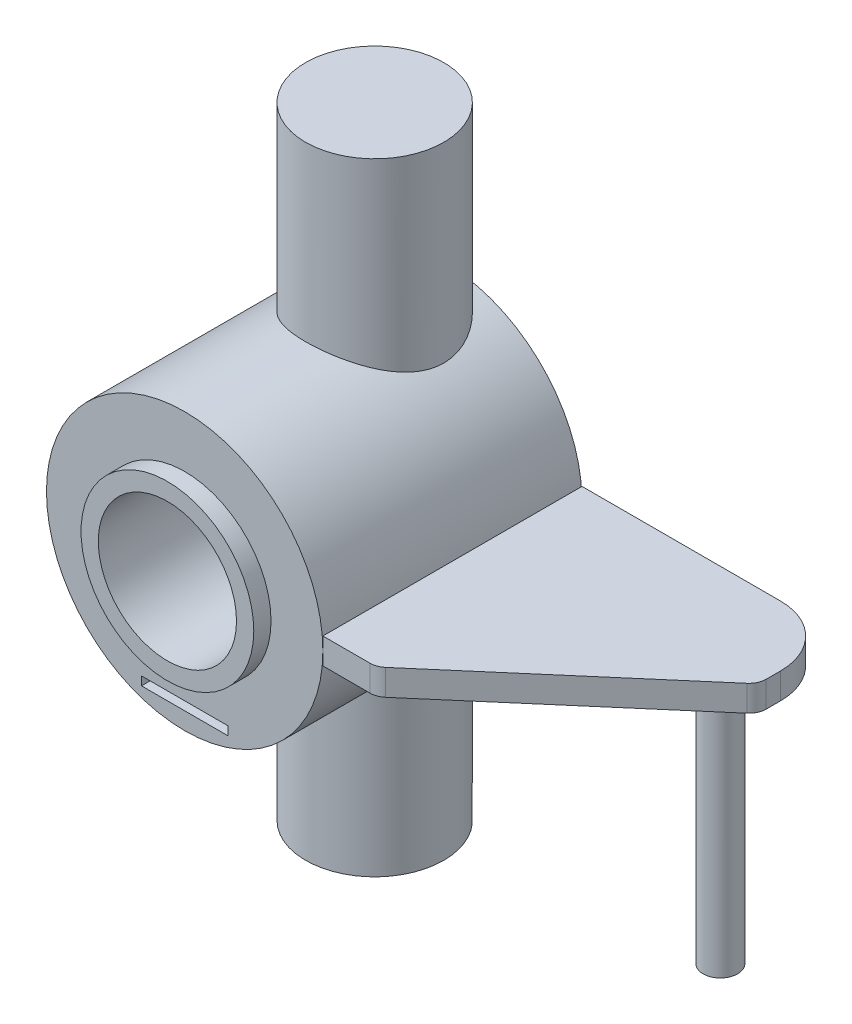
ISO-10303-21;
HEADER;
FILE_DESCRIPTION(('STEP AP214'),'2;1');
FILE_NAME('part.step','',(''),(''),'','','');
FILE_SCHEMA(('AUTOMOTIVE_DESIGN { 1 0 10303 214 1 1 1 1 }'));
ENDSEC;
DATA;
#1=APPLICATION_CONTEXT('core data for automotive mechanical design processes');
#2=APPLICATION_PROTOCOL_DEFINITION('international standard','automotive_design',2000,#1);
#3=PRODUCT_CONTEXT('',#1,'mechanical');
#4=PRODUCT('Part','Part','',(#3));
#5=PRODUCT_RELATED_PRODUCT_CATEGORY('part','',(#4));
#6=PRODUCT_DEFINITION_FORMATION('','',#4);
#7=PRODUCT_DEFINITION_CONTEXT('part definition',#1,'design');
#8=PRODUCT_DEFINITION('design','',#6,#7);
#9=PRODUCT_DEFINITION_SHAPE('','',#8);
#10=(LENGTH_UNIT() NAMED_UNIT(*) SI_UNIT(.MILLI.,.METRE.));
#11=(NAMED_UNIT(*) PLANE_ANGLE_UNIT() SI_UNIT($,.RADIAN.));
#12=(NAMED_UNIT(*) SI_UNIT($,.STERADIAN.) SOLID_ANGLE_UNIT());
#13=UNCERTAINTY_MEASURE_WITH_UNIT(LENGTH_MEASURE(1.E-05),#10,'distance_accuracy_value','');
#14=(GEOMETRIC_REPRESENTATION_CONTEXT(3) GLOBAL_UNCERTAINTY_ASSIGNED_CONTEXT((#13)) GLOBAL_UNIT_ASSIGNED_CONTEXT((#10,
#11,#12)) REPRESENTATION_CONTEXT('',''));
#15=CARTESIAN_POINT('',(0.,0.,0.));
#16=DIRECTION('',(0.,0.,1.));
#17=DIRECTION('',(1.,0.,0.));
#18=AXIS2_PLACEMENT_3D('',#15,#16,#17);
#19=CARTESIAN_POINT('',(23.,0.750000000000004,0.));
#20=DIRECTION('',(0.,-1.,0.));
#21=DIRECTION('',(0.,0.,-1.));
#22=AXIS2_PLACEMENT_3D('',#19,#20,#21);
#23=PLANE('',#22);
#24=DIRECTION('',(0.758813097039513,0.,-0.651308439805062));
#25=VECTOR('',#24,1.);
#26=CARTESIAN_POINT('',(25.3687248158512,0.750000000000003,2.75970539256084));
#27=LINE('',#26,#25);
#28=CARTESIAN_POINT('',(11.3890501755666,0.749999999999998,14.7588130970395));
#29=VERTEX_POINT('',#28);
#30=CARTESIAN_POINT('',(22.6513084398051,0.750000000000002,5.09213247781869));
#31=VERTEX_POINT('',#30);
#32=EDGE_CURVE('E126',#29,#31,#27,.T.);
#33=ORIENTED_EDGE('',*,*,#32,.T.);
#34=CARTESIAN_POINT('',(22.,0.750000000000002,4.33331938077917));
#35=DIRECTION('',(0.,-1.,0.));
#36=DIRECTION('',(0.,0.,-1.));
#37=AXIS2_PLACEMENT_3D('',#34,#35,#36);
#38=CIRCLE('',#37,1.);
#39=CARTESIAN_POINT('',(23.,0.750000000000002,4.33331938077917));
#40=VERTEX_POINT('',#39);
#41=EDGE_CURVE('E74',#31,#40,#38,.F.);
#42=ORIENTED_EDGE('',*,*,#41,.T.);
#43=DIRECTION('',(0.,0.,1.));
#44=VECTOR('',#43,1.);
#45=CARTESIAN_POINT('',(23.,0.750000000000004,0.));
#46=LINE('',#45,#44);
#47=CARTESIAN_POINT('',(23.,0.750000000000002,3.5));
#48=VERTEX_POINT('',#47);
#49=EDGE_CURVE('E146',#48,#40,#46,.T.);
#50=ORIENTED_EDGE('',*,*,#49,.F.);
#51=CARTESIAN_POINT('',(19.5,0.750000000000002,3.5));
#52=DIRECTION('',(0.,-1.,0.));
#53=DIRECTION('',(0.,0.,-1.));
#54=AXIS2_PLACEMENT_3D('',#51,#52,#53);
#55=CIRCLE('',#54,3.5);
#56=CARTESIAN_POINT('',(19.5,0.750000000000004,0.));
#57=VERTEX_POINT('',#56);
#58=EDGE_CURVE('E135',#57,#48,#55,.T.);
#59=ORIENTED_EDGE('',*,*,#58,.F.);
#60=DIRECTION('',(-1.,0.,0.));
#61=VECTOR('',#60,1.);
#62=CARTESIAN_POINT('',(23.,0.750000000000004,0.));
#63=LINE('',#62,#61);
#64=CARTESIAN_POINT('',(8.,0.750000000000004,0.));
#65=VERTEX_POINT('',#64);
#66=EDGE_CURVE('E134',#57,#65,#63,.T.);
#67=ORIENTED_EDGE('',*,*,#66,.T.);
#68=DIRECTION('',(0.,0.,1.));
#69=VECTOR('',#68,1.);
#70=CARTESIAN_POINT('',(8.,0.750000000000004,0.));
#71=LINE('',#70,#69);
#72=CARTESIAN_POINT('',(8.,0.749999999999998,15.));
#73=VERTEX_POINT('',#72);
#74=EDGE_CURVE('E226',#65,#73,#71,.T.);
#75=ORIENTED_EDGE('',*,*,#74,.T.);
#76=DIRECTION('',(-1.,0.,0.));
#77=VECTOR('',#76,1.);
#78=CARTESIAN_POINT('',(23.,0.749999999999998,15.));
#79=LINE('',#78,#77);
#80=CARTESIAN_POINT('',(10.7377417357616,0.749999999999998,15.));
#81=VERTEX_POINT('',#80);
#82=EDGE_CURVE('E144',#81,#73,#79,.T.);
#83=ORIENTED_EDGE('',*,*,#82,.F.);
#84=CARTESIAN_POINT('',(10.7377417357616,0.749999999999999,14.));
#85=DIRECTION('',(0.,-1.,0.));
#86=DIRECTION('',(0.,0.,-1.));
#87=AXIS2_PLACEMENT_3D('',#84,#85,#86);
#88=CIRCLE('',#87,1.);
#89=EDGE_CURVE('E161',#81,#29,#88,.F.);
#90=ORIENTED_EDGE('',*,*,#89,.T.);
#91=EDGE_LOOP('',(#33,#42,#50,#59,#67,#75,#83,#90));
#92=FACE_BOUND('',#91,.T.);
#93=ADVANCED_FACE('F51',(#92),#23,.F.);
#94=CARTESIAN_POINT('',(23.,-0.750000000000004,0.));
#95=DIRECTION('',(0.,1.,0.));
#96=DIRECTION('',(0.,0.,1.));
#97=AXIS2_PLACEMENT_3D('',#94,#95,#96);
#98=PLANE('',#97);
#99=CARTESIAN_POINT('',(19.4463189334762,-0.750000000000004,3.43499495567666));
#100=DIRECTION('',(0.,1.,0.));
#101=DIRECTION('',(0.,0.,1.));
#102=AXIS2_PLACEMENT_3D('',#99,#100,#101);
#103=CIRCLE('',#102,1.);
#104=CARTESIAN_POINT('',(19.4463189334762,-0.750000000000004,4.43499495567666));
#105=VERTEX_POINT('',#104);
#106=EDGE_CURVE('E12',#105,#105,#103,.F.);
#107=ORIENTED_EDGE('',*,*,#106,.F.);
#108=EDGE_LOOP('',(#107));
#109=FACE_BOUND('',#108,.T.);
#110=DIRECTION('',(0.,0.,-1.));
#111=VECTOR('',#110,1.);
#112=CARTESIAN_POINT('',(23.,-0.750000000000004,0.));
#113=LINE('',#112,#111);
#114=CARTESIAN_POINT('',(23.,-0.750000000000003,4.33331938077917));
#115=VERTEX_POINT('',#114);
#116=CARTESIAN_POINT('',(23.,-0.750000000000003,3.5));
#117=VERTEX_POINT('',#116);
#118=EDGE_CURVE('E142',#115,#117,#113,.T.);
#119=ORIENTED_EDGE('',*,*,#118,.F.);
#120=CARTESIAN_POINT('',(22.,-0.750000000000004,4.33331938077917));
#121=DIRECTION('',(0.,1.,0.));
#122=DIRECTION('',(0.,0.,1.));
#123=AXIS2_PLACEMENT_3D('',#120,#121,#122);
#124=CIRCLE('',#123,1.);
#125=CARTESIAN_POINT('',(22.6513084398051,-0.750000000000003,5.09213247781868));
#126=VERTEX_POINT('',#125);
#127=EDGE_CURVE('E59',#115,#126,#124,.F.);
#128=ORIENTED_EDGE('',*,*,#127,.T.);
#129=DIRECTION('',(0.758813097039512,0.,-0.651308439805062));
#130=VECTOR('',#129,1.);
#131=CARTESIAN_POINT('',(12.1253865423612,-0.750000000000002,14.1267970022992));
#132=LINE('',#131,#130);
#133=CARTESIAN_POINT('',(11.3890501755666,-0.750000000000002,14.7588130970395));
#134=VERTEX_POINT('',#133);
#135=EDGE_CURVE('E170',#134,#126,#132,.T.);
#136=ORIENTED_EDGE('',*,*,#135,.F.);
#137=CARTESIAN_POINT('',(10.7377417357616,-0.750000000000002,14.));
#138=DIRECTION('',(0.,1.,0.));
#139=DIRECTION('',(0.,0.,1.));
#140=AXIS2_PLACEMENT_3D('',#137,#138,#139);
#141=CIRCLE('',#140,1.);
#142=CARTESIAN_POINT('',(10.7377417357616,-0.750000000000002,15.));
#143=VERTEX_POINT('',#142);
#144=EDGE_CURVE('E157',#134,#143,#141,.F.);
#145=ORIENTED_EDGE('',*,*,#144,.T.);
#146=DIRECTION('',(-1.,0.,0.));
#147=VECTOR('',#146,1.);
#148=CARTESIAN_POINT('',(23.,-0.750000000000002,15.));
#149=LINE('',#148,#147);
#150=CARTESIAN_POINT('',(8.,-0.750000000000002,15.));
#151=VERTEX_POINT('',#150);
#152=EDGE_CURVE('E141',#143,#151,#149,.T.);
#153=ORIENTED_EDGE('',*,*,#152,.T.);
#154=DIRECTION('',(0.,0.,-1.));
#155=VECTOR('',#154,1.);
#156=CARTESIAN_POINT('',(8.,-0.750000000000004,0.));
#157=LINE('',#156,#155);
#158=CARTESIAN_POINT('',(8.,-0.750000000000004,0.));
#159=VERTEX_POINT('',#158);
#160=EDGE_CURVE('E139',#151,#159,#157,.T.);
#161=ORIENTED_EDGE('',*,*,#160,.T.);
#162=DIRECTION('',(-1.,0.,0.));
#163=VECTOR('',#162,1.);
#164=CARTESIAN_POINT('',(23.,-0.750000000000004,0.));
#165=LINE('',#164,#163);
#166=CARTESIAN_POINT('',(19.5,-0.750000000000004,0.));
#167=VERTEX_POINT('',#166);
#168=EDGE_CURVE('E132',#167,#159,#165,.T.);
#169=ORIENTED_EDGE('',*,*,#168,.F.);
#170=CARTESIAN_POINT('',(19.5,-0.750000000000003,3.5));
#171=DIRECTION('',(0.,-1.,0.));
#172=DIRECTION('',(0.,0.,-1.));
#173=AXIS2_PLACEMENT_3D('',#170,#171,#172);
#174=CIRCLE('',#173,3.5);
#175=EDGE_CURVE('E117',#167,#117,#174,.T.);
#176=ORIENTED_EDGE('',*,*,#175,.T.);
#177=EDGE_LOOP('',(#119,#128,#136,#145,#153,#161,#169,#176));
#178=FACE_BOUND('',#177,.T.);
#179=ADVANCED_FACE('F137',(#109,#178),#98,.F.);
#180=CARTESIAN_POINT('',(23.,-0.750000000000004,0.));
#181=DIRECTION('',(0.,0.,1.));
#182=DIRECTION('',(0.,-1.,0.));
#183=AXIS2_PLACEMENT_3D('',#180,#181,#182);
#184=PLANE('',#183);
#185=ORIENTED_EDGE('',*,*,#66,.F.);
#186=DIRECTION('',(0.,-1.,0.));
#187=VECTOR('',#186,1.);
#188=CARTESIAN_POINT('',(19.5,14.25,0.));
#189=LINE('',#188,#187);
#190=EDGE_CURVE('E120',#57,#167,#189,.T.);
#191=ORIENTED_EDGE('',*,*,#190,.T.);
#192=ORIENTED_EDGE('',*,*,#168,.T.);
#193=DIRECTION('',(0.,1.,0.));
#194=VECTOR('',#193,1.);
#195=CARTESIAN_POINT('',(8.,-0.750000000000004,0.));
#196=LINE('',#195,#194);
#197=EDGE_CURVE('E223',#159,#65,#196,.T.);
#198=ORIENTED_EDGE('',*,*,#197,.T.);
#199=EDGE_LOOP('',(#185,#191,#192,#198));
#200=FACE_BOUND('',#199,.T.);
#201=ADVANCED_FACE('F130',(#200),#184,.F.);
#202=CARTESIAN_POINT('',(23.,-0.750000000000002,15.));
#203=DIRECTION('',(0.,0.,-1.));
#204=DIRECTION('',(-1.,0.,0.));
#205=AXIS2_PLACEMENT_3D('',#202,#203,#204);
#206=PLANE('',#205);
#207=ORIENTED_EDGE('',*,*,#152,.F.);
#208=DIRECTION('',(0.,-1.,0.));
#209=VECTOR('',#208,1.);
#210=CARTESIAN_POINT('',(10.7377417357616,-0.750000000000004,15.));
#211=LINE('',#210,#209);
#212=EDGE_CURVE('E159',#143,#81,#211,.F.);
#213=ORIENTED_EDGE('',*,*,#212,.T.);
#214=ORIENTED_EDGE('',*,*,#82,.T.);
#215=DIRECTION('',(0.,-1.,0.));
#216=VECTOR('',#215,1.);
#217=CARTESIAN_POINT('',(8.,-0.750000000000002,15.));
#218=LINE('',#217,#216);
#219=EDGE_CURVE('E216',#73,#151,#218,.T.);
#220=ORIENTED_EDGE('',*,*,#219,.T.);
#221=EDGE_LOOP('',(#207,#213,#214,#220));
#222=FACE_BOUND('',#221,.T.);
#223=ADVANCED_FACE('F199',(#222),#206,.F.);
#224=CARTESIAN_POINT('',(23.,0.,0.));
#225=DIRECTION('',(1.,0.,0.));
#226=DIRECTION('',(0.,0.,-1.));
#227=AXIS2_PLACEMENT_3D('',#224,#225,#226);
#228=PLANE('',#227);
#229=ORIENTED_EDGE('',*,*,#49,.T.);
#230=DIRECTION('',(0.,1.,0.));
#231=VECTOR('',#230,1.);
#232=CARTESIAN_POINT('',(23.,-0.750000000000002,4.33331938077917));
#233=LINE('',#232,#231);
#234=EDGE_CURVE('E66',#40,#115,#233,.F.);
#235=ORIENTED_EDGE('',*,*,#234,.T.);
#236=ORIENTED_EDGE('',*,*,#118,.T.);
#237=DIRECTION('',(0.,-1.,0.));
#238=VECTOR('',#237,1.);
#239=CARTESIAN_POINT('',(23.,14.25,3.5));
#240=LINE('',#239,#238);
#241=EDGE_CURVE('E123',#48,#117,#240,.T.);
#242=ORIENTED_EDGE('',*,*,#241,.F.);
#243=EDGE_LOOP('',(#229,#235,#236,#242));
#244=FACE_BOUND('',#243,.T.);
#245=ADVANCED_FACE('F204',(#244),#228,.T.);
#246=CARTESIAN_POINT('',(8.,0.,0.));
#247=DIRECTION('',(1.,0.,0.));
#248=DIRECTION('',(0.,0.,-1.));
#249=AXIS2_PLACEMENT_3D('',#246,#247,#248);
#250=PLANE('',#249);
#251=ORIENTED_EDGE('',*,*,#197,.F.);
#252=ORIENTED_EDGE('',*,*,#160,.F.);
#253=ORIENTED_EDGE('',*,*,#219,.F.);
#254=ORIENTED_EDGE('',*,*,#74,.F.);
#255=EDGE_LOOP('',(#251,#252,#253,#254));
#256=FACE_BOUND('',#255,.T.);
#257=ADVANCED_FACE('F209',(#256),#250,.F.);
#258=CARTESIAN_POINT('',(19.5,14.25,3.5));
#259=DIRECTION('',(0.,-1.,0.));
#260=DIRECTION('',(0.,0.,-1.));
#261=AXIS2_PLACEMENT_3D('',#258,#259,#260);
#262=CYLINDRICAL_SURFACE('',#261,3.5);
#263=ORIENTED_EDGE('',*,*,#58,.T.);
#264=ORIENTED_EDGE('',*,*,#241,.T.);
#265=ORIENTED_EDGE('',*,*,#175,.F.);
#266=ORIENTED_EDGE('',*,*,#190,.F.);
#267=EDGE_LOOP('',(#263,#264,#265,#266));
#268=FACE_BOUND('',#267,.T.);
#269=ADVANCED_FACE('F119',(#268),#262,.T.);
#270=CARTESIAN_POINT('',(12.1253865423612,14.25,14.1267970022992));
#271=DIRECTION('',(-0.651308439805061,0.,-0.758813097039512));
#272=DIRECTION('',(-0.758813097039513,0.,0.651308439805062));
#273=AXIS2_PLACEMENT_3D('',#270,#271,#272);
#274=PLANE('',#273);
#275=ORIENTED_EDGE('',*,*,#135,.T.);
#276=DIRECTION('',(0.,1.,0.));
#277=VECTOR('',#276,1.);
#278=CARTESIAN_POINT('',(22.6513084398051,0.750000000000003,5.09213247781868));
#279=LINE('',#278,#277);
#280=EDGE_CURVE('E163',#126,#31,#279,.T.);
#281=ORIENTED_EDGE('',*,*,#280,.T.);
#282=ORIENTED_EDGE('',*,*,#32,.F.);
#283=DIRECTION('',(0.,-1.,0.));
#284=VECTOR('',#283,1.);
#285=CARTESIAN_POINT('',(11.3890501755666,14.25,14.7588130970395));
#286=LINE('',#285,#284);
#287=EDGE_CURVE('E154',#29,#134,#286,.T.);
#288=ORIENTED_EDGE('',*,*,#287,.T.);
#289=EDGE_LOOP('',(#275,#281,#282,#288));
#290=FACE_BOUND('',#289,.T.);
#291=ADVANCED_FACE('F174',(#290),#274,.F.);
#292=CARTESIAN_POINT('',(10.7377417357616,14.25,14.));
#293=DIRECTION('',(0.,-1.,0.));
#294=DIRECTION('',(1.,0.,0.));
#295=AXIS2_PLACEMENT_3D('',#292,#293,#294);
#296=CYLINDRICAL_SURFACE('',#295,1.);
#297=ORIENTED_EDGE('',*,*,#89,.F.);
#298=ORIENTED_EDGE('',*,*,#212,.F.);
#299=ORIENTED_EDGE('',*,*,#144,.F.);
#300=ORIENTED_EDGE('',*,*,#287,.F.);
#301=EDGE_LOOP('',(#297,#298,#299,#300));
#302=FACE_BOUND('',#301,.T.);
#303=ADVANCED_FACE('F181',(#302),#296,.T.);
#304=CARTESIAN_POINT('',(22.,14.25,4.33331938077917));
#305=DIRECTION('',(0.,-1.,0.));
#306=DIRECTION('',(0.,0.,-1.));
#307=AXIS2_PLACEMENT_3D('',#304,#305,#306);
#308=CYLINDRICAL_SURFACE('',#307,1.);
#309=ORIENTED_EDGE('',*,*,#127,.F.);
#310=ORIENTED_EDGE('',*,*,#234,.F.);
#311=ORIENTED_EDGE('',*,*,#41,.F.);
#312=ORIENTED_EDGE('',*,*,#280,.F.);
#313=EDGE_LOOP('',(#309,#310,#311,#312));
#314=FACE_BOUND('',#313,.T.);
#315=ADVANCED_FACE('F53',(#314),#308,.T.);
#316=CARTESIAN_POINT('',(19.4463189334762,-15.75,3.43499495567666));
#317=DIRECTION('',(0.,1.,0.));
#318=DIRECTION('',(0.,0.,1.));
#319=AXIS2_PLACEMENT_3D('',#316,#317,#318);
#320=CYLINDRICAL_SURFACE('',#319,1.);
#321=CARTESIAN_POINT('',(19.4463189334762,-15.75,3.43499495567666));
#322=DIRECTION('',(0.,-1.,0.));
#323=DIRECTION('',(0.,0.,-1.));
#324=AXIS2_PLACEMENT_3D('',#321,#322,#323);
#325=CIRCLE('',#324,1.);
#326=CARTESIAN_POINT('',(19.4463189334762,-15.75,2.43499495567666));
#327=VERTEX_POINT('',#326);
#328=EDGE_CURVE('E177',#327,#327,#325,.T.);
#329=ORIENTED_EDGE('',*,*,#328,.F.);
#330=EDGE_LOOP('',(#329));
#331=FACE_BOUND('',#330,.T.);
#332=ORIENTED_EDGE('',*,*,#106,.T.);
#333=EDGE_LOOP('',(#332));
#334=FACE_BOUND('',#333,.T.);
#335=ADVANCED_FACE('F180',(#331,#334),#320,.T.);
#336=CARTESIAN_POINT('',(0.,-15.75,0.));
#337=DIRECTION('',(0.,-1.,0.));
#338=DIRECTION('',(0.,0.,-1.));
#339=AXIS2_PLACEMENT_3D('',#336,#337,#338);
#340=PLANE('',#339);
#341=ORIENTED_EDGE('',*,*,#328,.T.);
#342=EDGE_LOOP('',(#341));
#343=FACE_BOUND('',#342,.T.);
#344=ADVANCED_FACE('F186',(#343),#340,.T.);
#345=CLOSED_SHELL('',(#93,#179,#201,#223,#245,#257,#269,#291,#303,#315,#335,#344));
#346=MANIFOLD_SOLID_BREP('B2',#345);
#347=CARTESIAN_POINT('',(0.,18.,4.));
#348=DIRECTION('',(0.,-1.,0.));
#349=DIRECTION('',(0.,0.,-1.));
#350=AXIS2_PLACEMENT_3D('',#347,#348,#349);
#351=CYLINDRICAL_SURFACE('',#350,4.);
#352=CARTESIAN_POINT('',(0.,18.,4.));
#353=DIRECTION('',(0.,1.,0.));
#354=DIRECTION('',(0.,0.,1.));
#355=AXIS2_PLACEMENT_3D('',#352,#353,#354);
#356=CIRCLE('',#355,4.);
#357=CARTESIAN_POINT('',(0.,18.,8.));
#358=VERTEX_POINT('',#357);
#359=EDGE_CURVE('E50',#358,#358,#356,.T.);
#360=ORIENTED_EDGE('',*,*,#359,.F.);
#361=EDGE_LOOP('',(#360));
#362=FACE_BOUND('',#361,.T.);
#363=CARTESIAN_POINT('',(0.,8.,8.));
#364=CARTESIAN_POINT('',(0.105191216468488,7.99999964432188,7.99999959515221));
#365=CARTESIAN_POINT('',(0.210389995368427,7.99792027620652,7.99584554268467));
#366=CARTESIAN_POINT('',(0.420011249701336,7.98965597150982,7.97927792190077));
#367=CARTESIAN_POINT('',(0.524433367425618,7.98346924887743,7.96686076043045));
#368=CARTESIAN_POINT('',(0.731828138370605,7.96713597659603,7.93388648530473));
#369=CARTESIAN_POINT('',(0.834798506711917,7.95698378017499,7.9133177633431));
#370=CARTESIAN_POINT('',(1.0384152051955,7.93298382243633,7.86428279244356));
#371=CARTESIAN_POINT('',(1.1390605669938,7.91913455043164,7.83581331493588));
#372=CARTESIAN_POINT('',(1.43561775388138,7.87265974292142,7.73925176888222));
#373=CARTESIAN_POINT('',(1.6271962065847,7.83501976471674,7.65983701915264));
#374=CARTESIAN_POINT('',(1.99392146995421,7.74982886318845,7.47371095891235));
#375=CARTESIAN_POINT('',(2.16906957469774,7.70227872135526,7.36700180061893));
#376=CARTESIAN_POINT('',(2.51002321260362,7.59825056785886,7.12193017740055));
#377=CARTESIAN_POINT('',(2.67462250306452,7.54140647262265,6.98204331180567));
#378=CARTESIAN_POINT('',(2.97911611963431,7.42640030348014,6.67792486241435));
#379=CARTESIAN_POINT('',(3.11899161990724,7.3682372629647,6.51367490095672));
#380=CARTESIAN_POINT('',(3.38102385527715,7.25195135134797,6.15002101287013));
#381=CARTESIAN_POINT('',(3.50096528772936,7.19418138823907,5.94887869572524));
#382=CARTESIAN_POINT('',(3.65378721735264,7.11709930290977,5.63206546004573));
#383=CARTESIAN_POINT('',(3.70022392693971,7.09299422837207,5.5239053371934));
#384=CARTESIAN_POINT('',(3.78359067078057,7.04887690211806,5.30319902892111));
#385=CARTESIAN_POINT('',(3.82052633371565,7.02886222858683,5.19065548607789));
#386=CARTESIAN_POINT('',(3.88251046204454,6.9948044998643,4.96880578069376));
#387=CARTESIAN_POINT('',(3.9081340887804,6.9804776446802,4.85970358083543));
#388=CARTESIAN_POINT('',(3.95018060072941,6.95677065788593,4.63925947717983));
#389=CARTESIAN_POINT('',(3.96660836750271,6.9473879018896,4.52791879424739));
#390=CARTESIAN_POINT('',(3.99001913809428,6.93396933490057,4.30399390653389));
#391=CARTESIAN_POINT('',(3.99700782997252,6.92993030376772,4.19141049191159));
#392=CARTESIAN_POINT('',(4.00144340059851,6.92737022415464,3.96599952196127));
#393=CARTESIAN_POINT('',(3.99889118971828,6.92884864921082,3.853171990953));
#394=CARTESIAN_POINT('',(3.98516575152016,6.93675038555112,3.64183562155368));
#395=CARTESIAN_POINT('',(3.97506329407581,6.94255931040713,3.54323256042783));
#396=CARTESIAN_POINT('',(3.94763759493625,6.95818925294571,3.34734838783369));
#397=CARTESIAN_POINT('',(3.93031208534669,6.96801153072177,3.2500677014795));
#398=CARTESIAN_POINT('',(3.86777248849784,7.00304835203764,2.96122086709978));
#399=CARTESIAN_POINT('',(3.81198555026409,7.03383903740602,2.77250454291879));
#400=CARTESIAN_POINT('',(3.67283599572519,7.10749917506982,2.4030536672292));
#401=CARTESIAN_POINT('',(3.58886132884632,7.15063327143764,2.22260742465183));
#402=CARTESIAN_POINT('',(3.39616568981264,7.2441365265382,1.87746981298511));
#403=CARTESIAN_POINT('',(3.28743360222607,7.29450893132236,1.71278556793507));
#404=CARTESIAN_POINT('',(3.03227252755196,7.40452458073482,1.38191711829539));
#405=CARTESIAN_POINT('',(2.88281182497071,7.46453347888883,1.21819042929159));
#406=CARTESIAN_POINT('',(2.55818830727484,7.58191186589975,0.917040393499512));
#407=CARTESIAN_POINT('',(2.38301327894514,7.63928008344308,0.779629617525468));
#408=CARTESIAN_POINT('',(2.09944472683198,7.7202760768617,0.593246969785754));
#409=CARTESIAN_POINT('',(1.9989679987013,7.74696304862188,0.533318240246936));
#410=CARTESIAN_POINT('',(1.79256850112001,7.79730441532266,0.42223352122335));
#411=CARTESIAN_POINT('',(1.68664805204876,7.82096008757468,0.37107383360208));
#412=CARTESIAN_POINT('',(1.47010242051538,7.86454042959534,0.278080877627199));
#413=CARTESIAN_POINT('',(1.35947915341347,7.88446660078232,0.236243854867457));
#414=CARTESIAN_POINT('',(1.13432950721217,7.91999221203723,0.162380061448199));
#415=CARTESIAN_POINT('',(1.01980357880328,7.9355921498224,0.130352162240849));
#416=CARTESIAN_POINT('',(0.797438403015335,7.96087677585623,0.0787731521448827));
#417=CARTESIAN_POINT('',(0.68983090685457,7.9709443603734,0.058408402943018));
#418=CARTESIAN_POINT('',(0.472998720376382,7.98674429615844,0.0265535517575012));
#419=CARTESIAN_POINT('',(0.363774173887724,7.99247703065614,0.0150626652629393));
#420=CARTESIAN_POINT('',(0.144648447401173,7.99944300548302,0.00110952845549016));
#421=CARTESIAN_POINT('',(0.0347475425961453,8.00067796839692,-0.00135617837901456));
#422=CARTESIAN_POINT('',(-0.184837638972486,7.99861804620746,0.00276424211008771));
#423=CARTESIAN_POINT('',(-0.294521925108021,7.99532336157662,0.00934996883659231));
#424=CARTESIAN_POINT('',(-0.504259611746538,7.98472734940324,0.0306235695271645));
#425=CARTESIAN_POINT('',(-0.604398259266984,7.97775776257091,0.0446410691044307));
#426=CARTESIAN_POINT('',(-0.803035609307668,7.96021983565123,0.0801363996639103));
#427=CARTESIAN_POINT('',(-0.901533743070587,7.94965027363514,0.101616763793442));
#428=CARTESIAN_POINT('',(-1.19351737727532,7.91289127905722,0.176935173599938));
#429=CARTESIAN_POINT('',(-1.38368108667204,7.88164133135127,0.241670140590663));
#430=CARTESIAN_POINT('',(-1.75558493783058,7.80736894774679,0.399998108905637));
#431=CARTESIAN_POINT('',(-1.93692876519228,7.76403545540105,0.494363309171963));
#432=CARTESIAN_POINT('',(-2.28183826656572,7.66975878800211,0.708431034259749));
#433=CARTESIAN_POINT('',(-2.44539632212196,7.61881237399843,0.828144352631561));
#434=CARTESIAN_POINT('',(-2.76706877708067,7.50833088367007,1.10303311970347));
#435=CARTESIAN_POINT('',(-2.92307134240145,7.44844369061623,1.26053653725913));
#436=CARTESIAN_POINT('',(-3.20744226426287,7.33048735856255,1.5997355652547));
#437=CARTESIAN_POINT('',(-3.33579150415337,7.27241950081065,1.7814477716031));
#438=CARTESIAN_POINT('',(-3.50772930633183,7.19028164087441,2.0739940144221));
#439=CARTESIAN_POINT('',(-3.5626157867948,7.16316684054651,2.17748375843627));
#440=CARTESIAN_POINT('',(-3.66334616154282,7.11217812644117,2.38951843531651));
#441=CARTESIAN_POINT('',(-3.70919441458265,7.08830265221425,2.49806090009515));
#442=CARTESIAN_POINT('',(-3.79131200961919,7.04472262103751,2.71942164536428));
#443=CARTESIAN_POINT('',(-3.82758904080802,7.02501471854545,2.83223640979536));
#444=CARTESIAN_POINT('',(-3.89012004539429,6.9905825381999,3.06135278907153));
#445=CARTESIAN_POINT('',(-3.91637557070638,6.97585748874971,3.17765386102154));
#446=CARTESIAN_POINT('',(-3.95643062416587,6.95321025619991,3.40141213316309));
#447=CARTESIAN_POINT('',(-3.97118378192521,6.94477079792059,3.50864683290839));
#448=CARTESIAN_POINT('',(-3.99195118317071,6.93285441469714,3.72422767020064));
#449=CARTESIAN_POINT('',(-3.99796634225491,6.92937696981658,3.8325736901013));
#450=CARTESIAN_POINT('',(-4.00116308319383,6.92753208063799,4.04940749673038));
#451=CARTESIAN_POINT('',(-3.99834777004019,6.9291628401807,4.15789522022328));
#452=CARTESIAN_POINT('',(-3.98394653809981,6.9374509348198,4.37406114711354));
#453=CARTESIAN_POINT('',(-3.97236097836303,6.94410806413885,4.48173938346867));
#454=CARTESIAN_POINT('',(-3.92770249100378,6.96952879582861,4.7818001370413));
#455=CARTESIAN_POINT('',(-3.88483285002042,6.99372760142387,4.97236586731381));
#456=CARTESIAN_POINT('',(-3.77270184038046,7.05483682415845,5.34326850255324));
#457=CARTESIAN_POINT('',(-3.70343198216887,7.09175132993569,5.52360209570391));
#458=CARTESIAN_POINT('',(-3.53526338936952,7.17714225279385,5.882488553514));
#459=CARTESIAN_POINT('',(-3.43468670285354,7.22622883383996,6.06010777576172));
#460=CARTESIAN_POINT('',(-3.20860173383709,7.3294133274236,6.39710197827703));
#461=CARTESIAN_POINT('',(-3.08308048046464,7.38351383930109,6.55646739854074));
#462=CARTESIAN_POINT('',(-2.79282250805389,7.49849148240842,6.8725629090385));
#463=CARTESIAN_POINT('',(-2.62517402605099,7.55939328373464,7.02661992962373));
#464=CARTESIAN_POINT('',(-2.26458287075638,7.67511613929542,7.3050684228129));
#465=CARTESIAN_POINT('',(-2.07162664990559,7.72993390744395,7.42944390524207));
#466=CARTESIAN_POINT('',(-1.76603106757846,7.80335210517359,7.59090424941519));
#467=CARTESIAN_POINT('',(-1.66100410373827,7.82643367929072,7.64069364140905));
#468=CARTESIAN_POINT('',(-1.44639623629744,7.8689179624278,7.73114894700146));
#469=CARTESIAN_POINT('',(-1.33681760142932,7.88832247803741,7.77181934269804));
#470=CARTESIAN_POINT('',(-1.11415600876093,7.92283587265691,7.84347634443401));
#471=CARTESIAN_POINT('',(-1.00108129646084,7.93795411409434,7.87448407138671));
#472=CARTESIAN_POINT('',(-0.772189766950842,7.96347694583626,7.92651008001648));
#473=CARTESIAN_POINT('',(-0.656374670304615,7.97388441530454,7.94753446377235));
#474=CARTESIAN_POINT('',(-0.450433316283305,7.98781110043795,7.97557962119869));
#475=CARTESIAN_POINT('',(-0.360660623567813,7.99237392421376,7.98472938917604));
#476=CARTESIAN_POINT('',(-0.180593821057088,7.99846856848791,7.99693983637807));
#477=CARTESIAN_POINT('',(-0.0902996969389666,8.00000030532612,8.00000034753503));
#478=CARTESIAN_POINT('',(0.,8.,8.));
#479=B_SPLINE_CURVE_WITH_KNOTS('',3,(#363,#364,#365,#366,#367,#368,#369,#370,#371,#372,#373,
#374,#375,#376,#377,#378,#379,#380,#381,#382,#383,#384,#385,#386,#387,#388,#389,#390,#391,#392,
#393,#394,#395,#396,#397,#398,#399,#400,#401,#402,#403,#404,#405,#406,#407,#408,#409,#410,#411,
#412,#413,#414,#415,#416,#417,#418,#419,#420,#421,#422,#423,#424,#425,#426,#427,#428,#429,#430,
#431,#432,#433,#434,#435,#436,#437,#438,#439,#440,#441,#442,#443,#444,#445,#446,#447,#448,#449,
#450,#451,#452,#453,#454,#455,#456,#457,#458,#459,#460,#461,#462,#463,#464,#465,#466,#467,#468,
#469,#470,#471,#472,#473,#474,#475,#476,#477,#478),.UNSPECIFIED.,.T.,.F.,(4,2,2,2,2,2,2,2,2,2,2,
2,2,2,2,2,2,2,2,2,2,2,2,2,2,2,2,2,2,2,2,2,2,2,2,2,2,2,2,2,2,2,2,2,2,2,2,2,2,2,2,2,2,2,2,2,2,4),
(0.,0.315484235719912,0.631105747230253,0.947178346952276,1.26338029745354,1.89263632058595,
2.52184274094302,3.18911473348911,3.85689264923289,4.57645675584686,4.93648208726456,
5.29629363598333,5.63476191634051,5.97305035229576,6.31113484191767,6.64918707308226,
6.94669148652859,7.24428938086225,7.83905304157541,8.44767049128776,9.05656173495714,
9.74265853790341,10.4290822684957,10.7886699173095,11.1481055433964,11.5073961555811,
11.8666454155399,12.1961419049363,12.5256092612256,12.8549504227676,13.184277008843,
13.4879760335491,13.791778244799,14.3988188497914,15.02321622567,15.6478800144877,
16.33388641032,17.0203655291613,17.380682030865,17.7408243397693,18.1006764355618,
18.4604727825931,18.7857371805984,19.1109674938045,19.4360834615763,19.7611861199664,
20.3488209353335,20.9366448769134,21.5639619965908,22.1916061711245,22.8955134356508,
23.5997990605888,23.9548906509477,24.3098073249809,24.6639426811876,25.0178613011449,
25.2886761616556,25.5594984967416),.UNSPECIFIED.);
#480=CARTESIAN_POINT('',(0.,8.,8.));
#481=VERTEX_POINT('',#480);
#482=EDGE_CURVE('E329',#481,#481,#479,.T.);
#483=ORIENTED_EDGE('',*,*,#482,.T.);
#484=EDGE_LOOP('',(#483));
#485=FACE_BOUND('',#484,.T.);
#486=ADVANCED_FACE('F323',(#362,#485),#351,.T.);
#487=CARTESIAN_POINT('',(0.,18.,4.));
#488=DIRECTION('',(0.,1.,0.));
#489=DIRECTION('',(0.,0.,1.));
#490=AXIS2_PLACEMENT_3D('',#487,#488,#489);
#491=PLANE('',#490);
#492=ORIENTED_EDGE('',*,*,#359,.T.);
#493=EDGE_LOOP('',(#492));
#494=FACE_BOUND('',#493,.T.);
#495=ADVANCED_FACE('F344',(#494),#491,.T.);
#496=CARTESIAN_POINT('',(0.,0.,15.));
#497=DIRECTION('',(0.,0.,-1.));
#498=DIRECTION('',(-1.,0.,0.));
#499=AXIS2_PLACEMENT_3D('',#496,#497,#498);
#500=CYLINDRICAL_SURFACE('',#499,8.);
#501=ORIENTED_EDGE('',*,*,#482,.F.);
#502=EDGE_LOOP('',(#501));
#503=FACE_BOUND('',#502,.T.);
#504=ADVANCED_FACE('F341',(#503),#500,.F.);
#505=CLOSED_SHELL('',(#486,#495,#504));
#506=MANIFOLD_SOLID_BREP('B6',#505);
#507=CARTESIAN_POINT('',(0.,0.,15.));
#508=DIRECTION('',(0.,0.,-1.));
#509=DIRECTION('',(-1.,0.,0.));
#510=AXIS2_PLACEMENT_3D('',#507,#508,#509);
#511=CYLINDRICAL_SURFACE('',#510,8.);
#512=CARTESIAN_POINT('',(0.,0.,15.));
#513=DIRECTION('',(0.,0.,1.));
#514=DIRECTION('',(1.,0.,0.));
#515=AXIS2_PLACEMENT_3D('',#512,#513,#514);
#516=CIRCLE('',#515,8.);
#517=CARTESIAN_POINT('',(8.,0.,15.));
#518=VERTEX_POINT('',#517);
#519=EDGE_CURVE('E321',#518,#518,#516,.T.);
#520=ORIENTED_EDGE('',*,*,#519,.F.);
#521=EDGE_LOOP('',(#520));
#522=FACE_BOUND('',#521,.T.);
#523=CARTESIAN_POINT('',(0.,0.,0.));
#524=DIRECTION('',(0.,0.,1.));
#525=DIRECTION('',(1.,0.,0.));
#526=AXIS2_PLACEMENT_3D('',#523,#524,#525);
#527=CIRCLE('',#526,8.);
#528=CARTESIAN_POINT('',(0.,-8.,0.));
#529=VERTEX_POINT('',#528);
#530=EDGE_CURVE('E375',#529,#529,#527,.T.);
#531=ORIENTED_EDGE('',*,*,#530,.T.);
#532=CARTESIAN_POINT('',(4.00000000000001,-6.9282032302755,4.));
#533=CARTESIAN_POINT('',(3.99999950219345,-6.92820386262826,4.1042653254373));
#534=CARTESIAN_POINT('',(3.9959176319954,-6.93056511456488,4.20853992667939));
#535=CARTESIAN_POINT('',(3.97964472112407,-6.93992172463862,4.41628417460038));
#536=CARTESIAN_POINT('',(3.96744990521399,-6.94691924018481,4.51975342383269));
#537=CARTESIAN_POINT('',(3.93508538297522,-6.96530330045203,4.72521084556988));
#538=CARTESIAN_POINT('',(3.91490316893164,-6.97669672816262,4.82719643382953));
#539=CARTESIAN_POINT('',(3.86682062971259,-7.00345973447504,5.02881400167829));
#540=CARTESIAN_POINT('',(3.83891695064122,-7.01883104071991,5.12844493804267));
#541=CARTESIAN_POINT('',(3.74442772916635,-7.06996541785761,5.42168896600919));
#542=CARTESIAN_POINT('',(3.66684915651286,-7.11087904783325,5.61098585661696));
#543=CARTESIAN_POINT('',(3.4850607538011,-7.20170927952067,5.97372956380103));
#544=CARTESIAN_POINT('',(3.38084948302617,-7.25162636823861,6.14717552221941));
#545=CARTESIAN_POINT('',(3.13867639492106,-7.3598722626408,6.48920849434794));
#546=CARTESIAN_POINT('',(2.99863981046009,-7.41855528289904,6.65621486644762));
#547=CARTESIAN_POINT('',(2.69298354883076,-7.53488657765781,6.96565524064934));
#548=CARTESIAN_POINT('',(2.52735118809494,-7.59253432325008,7.10807698576393));
#549=CARTESIAN_POINT('',(2.25626437810993,-7.6758759355965,7.30498206648215));
#550=CARTESIAN_POINT('',(2.15870290429516,-7.70394919240218,7.36953226161913));
#551=CARTESIAN_POINT('',(1.95777427065883,-7.75744193796062,7.49010444022811));
#552=CARTESIAN_POINT('',(1.85440960246324,-7.78286255243594,7.54613004600924));
#553=CARTESIAN_POINT('',(1.64251485422607,-7.83032159918279,7.64911278165759));
#554=CARTESIAN_POINT('',(1.53398485456802,-7.85236008406491,7.6960700525899));
#555=CARTESIAN_POINT('',(1.3125858096749,-7.89238619731919,7.78036194826573));
#556=CARTESIAN_POINT('',(1.19971924732416,-7.91037610439248,7.81770198768932));
#557=CARTESIAN_POINT('',(0.978622575683248,-7.94064573590697,7.88001829427466));
#558=CARTESIAN_POINT('',(0.870629018183695,-7.95323930006917,7.90568215305844));
#559=CARTESIAN_POINT('',(0.652524088435726,-7.97409583861317,7.94797970743347));
#560=CARTESIAN_POINT('',(0.542413779814414,-7.98236093189931,7.96461782151572));
#561=CARTESIAN_POINT('',(0.320973525125338,-7.99432715952591,7.98865586699747));
#562=CARTESIAN_POINT('',(0.209643937931229,-7.99802960221736,7.99605844671614));
#563=CARTESIAN_POINT('',(-0.0132971447801722,-8.0007656004484,8.00153168636999));
#564=CARTESIAN_POINT('',(-0.124908622632314,-7.99979944163708,7.99960291724515));
#565=CARTESIAN_POINT('',(-0.337727985342423,-7.99351360464185,7.98701479129273));
#566=CARTESIAN_POINT('',(-0.438993817716938,-7.98858118408677,7.97713197765086));
#567=CARTESIAN_POINT('',(-0.640243249291353,-7.97497880011988,7.94973672090394));
#568=CARTESIAN_POINT('',(-0.740226424897065,-7.96630763313356,7.93222182086393));
#569=CARTESIAN_POINT('',(-1.03714138295469,-7.93497195498556,7.86848947730556));
#570=CARTESIAN_POINT('',(-1.23123936013571,-7.9069787607081,7.81107210299894));
#571=CARTESIAN_POINT('',(-1.6092687156014,-7.83886272517952,7.6676660261144));
#572=CARTESIAN_POINT('',(-1.79302228049015,-7.79857742343273,7.58129301759658));
#573=CARTESIAN_POINT('',(-2.14389861654609,-7.70950607728793,7.38294806552919));
#574=CARTESIAN_POINT('',(-2.31101540282593,-7.66071699099023,7.27096695718556));
#575=CARTESIAN_POINT('',(-2.64069813790284,-7.55377539869557,7.01241508000272));
#576=CARTESIAN_POINT('',(-2.80134064782814,-7.49517374441381,6.86357523984661));
#577=CARTESIAN_POINT('',(-3.096413130151,-7.37817491997775,6.54165375681343));
#578=CARTESIAN_POINT('',(-3.23082293513642,-7.31977794078033,6.36855363717567));
#579=CARTESIAN_POINT('',(-3.47803613314163,-7.20576112808083,5.98935711133187));
#580=CARTESIAN_POINT('',(-3.58892539602577,-7.15055315383099,5.78186338145237));
#581=CARTESIAN_POINT('',(-3.72723782010754,-7.07886925416584,5.45658261556123));
#582=CARTESIAN_POINT('',(-3.76867730715225,-7.05682593849463,5.34579164080266));
#583=CARTESIAN_POINT('',(-3.84175062064906,-7.01731299636541,5.12025515321879));
#584=CARTESIAN_POINT('',(-3.87339049322799,-6.99984055082838,5.00551212747387));
#585=CARTESIAN_POINT('',(-3.92431909326376,-6.97140602598867,4.78217133548265));
#586=CARTESIAN_POINT('',(-3.94438433855718,-6.96003957007805,4.67380134853994));
#587=CARTESIAN_POINT('',(-3.97551851361913,-6.94230335544128,4.45541909952217));
#588=CARTESIAN_POINT('',(-3.98659212183613,-6.93593099829036,4.34540772186559));
#589=CARTESIAN_POINT('',(-3.99958291311108,-6.92844811909925,4.12470748996731));
#590=CARTESIAN_POINT('',(-4.00150350567567,-6.92733563775176,4.01401890337321));
#591=CARTESIAN_POINT('',(-3.99616718095744,-6.93041539174955,3.79294330689436));
#592=CARTESIAN_POINT('',(-3.98891088315149,-6.93460726902939,3.68255627715739));
#593=CARTESIAN_POINT('',(-3.96663154579714,-6.94737197203376,3.47513061602036));
#594=CARTESIAN_POINT('',(-3.95254845698989,-6.95541341326253,3.3779567889877));
#595=CARTESIAN_POINT('',(-3.91737385475212,-6.97528372672039,3.18526806656622));
#596=CARTESIAN_POINT('',(-3.89628002700134,-6.98711384958699,3.08975372996381));
#597=CARTESIAN_POINT('',(-3.82280238446313,-7.02775685901555,2.80663196389194));
#598=CARTESIAN_POINT('',(-3.76020731695077,-7.06173163693377,2.62230856572734));
#599=CARTESIAN_POINT('',(-3.60658595732554,-7.14144993292041,2.25832541229841));
#600=CARTESIAN_POINT('',(-3.51437713951607,-7.18766564346826,2.07927704666103));
#601=CARTESIAN_POINT('',(-3.30514737086267,-7.28624486618866,1.73812980331287));
#602=CARTESIAN_POINT('',(-3.18811367399407,-7.33861153030439,1.57603969669191));
#603=CARTESIAN_POINT('',(-2.91535761342628,-7.45151836616993,1.25208687714178));
#604=CARTESIAN_POINT('',(-2.75661800037809,-7.51225675092662,1.09282841283409));
#605=CARTESIAN_POINT('',(-2.41358105803055,-7.62937597657745,0.802334026584154));
#606=CARTESIAN_POINT('',(-2.22927513013699,-7.68575534144676,0.671107570383756));
#607=CARTESIAN_POINT('',(-1.93419225408146,-7.76335543938379,0.496792217762809));
#608=CARTESIAN_POINT('',(-1.83122945254024,-7.78834354202674,0.441869942701289));
#609=CARTESIAN_POINT('',(-1.62028527572798,-7.83494183925331,0.34099446912297));
#610=CARTESIAN_POINT('',(-1.51230618469743,-7.85655355213899,0.295037236861767));
#611=CARTESIAN_POINT('',(-1.29213403393068,-7.89575152015211,0.212625673359868));
#612=CARTESIAN_POINT('',(-1.17994299872754,-7.91333968113673,0.176166841820374));
#613=CARTESIAN_POINT('',(-0.952197786601979,-7.94396070933363,0.113192739054084));
#614=CARTESIAN_POINT('',(-0.836644010238124,-7.95699411670659,0.0866762887059286));
#615=CARTESIAN_POINT('',(-0.613942900584693,-7.97711749125789,0.0459279500527829));
#616=CARTESIAN_POINT('',(-0.506999857370266,-7.98464383966398,0.0307905272241886));
#617=CARTESIAN_POINT('',(-0.291983714868724,-7.99539449729097,0.00920788664752355));
#618=CARTESIAN_POINT('',(-0.183910251308576,-7.99861737381754,0.00276556362899211));
#619=CARTESIAN_POINT('',(0.03236920279163,-8.00066496370437,-0.00133014208550515));
#620=CARTESIAN_POINT('',(0.140575049615288,-7.99949272302419,0.00101038841557485));
#621=CARTESIAN_POINT('',(0.356345776551111,-7.99278884324615,0.0144376708259707));
#622=CARTESIAN_POINT('',(0.463910407218418,-7.9872556066098,0.0255276278637623));
#623=CARTESIAN_POINT('',(0.670402230454413,-7.97248705040341,0.0552939773904399));
#624=CARTESIAN_POINT('',(0.769428771379719,-7.96352188946078,0.0734178487040997));
#625=CARTESIAN_POINT('',(0.96549401655823,-7.94213883037982,0.116969937488292));
#626=CARTESIAN_POINT('',(1.06253202988244,-7.92971975328176,0.142400649174037));
#627=CARTESIAN_POINT('',(1.34967669515382,-7.88769036296796,0.229286595750671));
#628=CARTESIAN_POINT('',(1.535990515319,-7.85329454083082,0.301361540160017));
#629=CARTESIAN_POINT('',(1.90172389087137,-7.77303546188782,0.474913777280617));
#630=CARTESIAN_POINT('',(2.08050775123498,-7.72674465907378,0.577516772333945));
#631=CARTESIAN_POINT('',(2.41909138351715,-7.62752535456451,0.80783224417312));
#632=CARTESIAN_POINT('',(2.57888238184509,-7.57459380826236,0.935556253632443));
#633=CARTESIAN_POINT('',(2.8916543099683,-7.46114622775076,1.22718013687798));
#634=CARTESIAN_POINT('',(3.04237488708293,-7.40039963213063,1.39341522683605));
#635=CARTESIAN_POINT('',(3.31466901461284,-7.28251536809497,1.74983763817227));
#636=CARTESIAN_POINT('',(3.43621677845464,-7.22538092516391,1.94004592524942));
#637=CARTESIAN_POINT('',(3.59554085555899,-7.14673032771597,2.24337573615295));
#638=CARTESIAN_POINT('',(3.64540546855455,-7.12134958638073,2.34930106826833));
#639=CARTESIAN_POINT('',(3.7358834166029,-7.07430377646636,2.56580437696515));
#640=CARTESIAN_POINT('',(3.77650151690077,-7.05263679540785,2.67637992206191));
#641=CARTESIAN_POINT('',(3.84790167044831,-7.01393620687008,2.90112629943264));
#642=CARTESIAN_POINT('',(3.87870902746066,-6.99689069691894,3.01528703446802));
#643=CARTESIAN_POINT('',(3.93016568856618,-6.96811827819219,3.24647371557682));
#644=CARTESIAN_POINT('',(3.95082209480825,-6.95638765128934,3.36349759808763));
#645=CARTESIAN_POINT('',(3.97745846425998,-6.94118032889089,3.56719830954344));
#646=CARTESIAN_POINT('',(3.98590343866334,-6.93632575562013,3.6534593729815));
#647=CARTESIAN_POINT('',(3.99717460159989,-6.92983683549392,3.82647812798563));
#648=CARTESIAN_POINT('',(4.00000041424857,-6.92820270406463,3.91323585238573));
#649=CARTESIAN_POINT('',(4.00000000000001,-6.9282032302755,4.));
#650=B_SPLINE_CURVE_WITH_KNOTS('',3,(#532,#533,#534,#535,#536,#537,#538,#539,#540,#541,#542,
#543,#544,#545,#546,#547,#548,#549,#550,#551,#552,#553,#554,#555,#556,#557,#558,#559,#560,#561,
#562,#563,#564,#565,#566,#567,#568,#569,#570,#571,#572,#573,#574,#575,#576,#577,#578,#579,#580,
#581,#582,#583,#584,#585,#586,#587,#588,#589,#590,#591,#592,#593,#594,#595,#596,#597,#598,#599,
#600,#601,#602,#603,#604,#605,#606,#607,#608,#609,#610,#611,#612,#613,#614,#615,#616,#617,#618,
#619,#620,#621,#622,#623,#624,#625,#626,#627,#628,#629,#630,#631,#632,#633,#634,#635,#636,#637,
#638,#639,#640,#641,#642,#643,#644,#645,#646,#647,#648,#649),.UNSPECIFIED.,.T.,.F.,(4,2,2,2,2,2,
2,2,2,2,2,2,2,2,2,2,2,2,2,2,2,2,2,2,2,2,2,2,2,2,2,2,2,2,2,2,2,2,2,2,2,2,2,2,2,2,2,2,2,2,2,2,2,2,
2,2,2,2,4),(0.,0.312705907645188,0.625557430139016,0.93890080736969,1.25238050266336,
1.87532331508721,2.49829983322606,3.1726581814384,3.8473517748203,4.20786878872691,
4.56823217961299,4.92858996431118,5.28874441516655,5.62343001077676,5.95795161516748,
6.29237727234833,6.62678246790366,6.93200651230821,7.23732888766059,7.84737748897727,
8.46586637752493,9.08457696228994,9.76177264655468,10.4394869181158,11.160238657457,
11.5207615871968,11.8810616378014,12.212984058814,12.5447336660446,12.8763596865808,
13.2079633222266,13.5031682056198,13.7984706362685,14.38866539675,15.006195155551,
15.6240427481094,16.319773042532,17.0157378984356,17.3733524504477,17.7308057238246,
18.0880893282017,18.4453305469501,18.7697157004162,19.0942088199644,19.4184770967801,
19.7428642161659,20.0457160884446,20.3486714633268,20.9540518089476,21.585324497246,
22.2168876724958,22.9113041424698,23.6063321822733,23.9652997079033,24.3240818165632,
24.6819309195696,25.0395292944428,25.2997293817866,25.5599468741983),.UNSPECIFIED.);
#651=EDGE_CURVE('E448',#529,#529,#650,.T.);
#652=ORIENTED_EDGE('',*,*,#651,.F.);
#653=EDGE_LOOP('',(#531,#652));
#654=FACE_BOUND('',#653,.T.);
#655=ADVANCED_FACE('F372',(#522,#654),#511,.T.);
#656=CARTESIAN_POINT('',(0.,0.,15.));
#657=DIRECTION('',(0.,0.,1.));
#658=DIRECTION('',(1.,0.,0.));
#659=AXIS2_PLACEMENT_3D('',#656,#657,#658);
#660=PLANE('',#659);
#661=DIRECTION('',(0.,1.,0.));
#662=VECTOR('',#661,1.);
#663=CARTESIAN_POINT('',(2.5,-7.,15.));
#664=LINE('',#663,#662);
#665=CARTESIAN_POINT('',(2.5,-7.,15.));
#666=VERTEX_POINT('',#665);
#667=CARTESIAN_POINT('',(2.5,-6.5,15.));
#668=VERTEX_POINT('',#667);
#669=EDGE_CURVE('E386',#666,#668,#664,.T.);
#670=ORIENTED_EDGE('',*,*,#669,.F.);
#671=DIRECTION('',(1.,0.,0.));
#672=VECTOR('',#671,1.);
#673=CARTESIAN_POINT('',(2.5,-7.,15.));
#674=LINE('',#673,#672);
#675=CARTESIAN_POINT('',(-2.5,-7.,15.));
#676=VERTEX_POINT('',#675);
#677=EDGE_CURVE('E433',#676,#666,#674,.T.);
#678=ORIENTED_EDGE('',*,*,#677,.F.);
#679=DIRECTION('',(0.,-1.,0.));
#680=VECTOR('',#679,1.);
#681=CARTESIAN_POINT('',(-2.5,-7.,15.));
#682=LINE('',#681,#680);
#683=CARTESIAN_POINT('',(-2.5,-6.5,15.));
#684=VERTEX_POINT('',#683);
#685=EDGE_CURVE('E436',#684,#676,#682,.T.);
#686=ORIENTED_EDGE('',*,*,#685,.F.);
#687=DIRECTION('',(-1.,0.,0.));
#688=VECTOR('',#687,1.);
#689=CARTESIAN_POINT('',(2.5,-6.5,15.));
#690=LINE('',#689,#688);
#691=EDGE_CURVE('E442',#668,#684,#690,.T.);
#692=ORIENTED_EDGE('',*,*,#691,.F.);
#693=EDGE_LOOP('',(#670,#678,#686,#692));
#694=FACE_BOUND('',#693,.T.);
#695=CARTESIAN_POINT('',(0.,0.,15.));
#696=DIRECTION('',(0.,0.,1.));
#697=DIRECTION('',(1.,0.,0.));
#698=AXIS2_PLACEMENT_3D('',#695,#696,#697);
#699=CIRCLE('',#698,5.);
#700=CARTESIAN_POINT('',(5.,0.,15.));
#701=VERTEX_POINT('',#700);
#702=EDGE_CURVE('E495',#701,#701,#699,.T.);
#703=ORIENTED_EDGE('',*,*,#702,.F.);
#704=EDGE_LOOP('',(#703));
#705=FACE_BOUND('',#704,.T.);
#706=ORIENTED_EDGE('',*,*,#519,.T.);
#707=EDGE_LOOP('',(#706));
#708=FACE_BOUND('',#707,.T.);
#709=ADVANCED_FACE('F482',(#694,#705,#708),#660,.T.);
#710=CARTESIAN_POINT('',(0.,0.,0.));
#711=DIRECTION('',(0.,0.,1.));
#712=DIRECTION('',(1.,0.,0.));
#713=AXIS2_PLACEMENT_3D('',#710,#711,#712);
#714=PLANE('',#713);
#715=CARTESIAN_POINT('',(0.,0.,0.));
#716=DIRECTION('',(0.,0.,1.));
#717=DIRECTION('',(1.,0.,0.));
#718=AXIS2_PLACEMENT_3D('',#715,#716,#717);
#719=CIRCLE('',#718,4.);
#720=CARTESIAN_POINT('',(4.,0.,0.));
#721=VERTEX_POINT('',#720);
#722=EDGE_CURVE('E504',#721,#721,#719,.T.);
#723=ORIENTED_EDGE('',*,*,#722,.T.);
#724=EDGE_LOOP('',(#723));
#725=FACE_BOUND('',#724,.T.);
#726=ORIENTED_EDGE('',*,*,#530,.F.);
#727=EDGE_LOOP('',(#726));
#728=FACE_BOUND('',#727,.T.);
#729=ADVANCED_FACE('F487',(#725,#728),#714,.F.);
#730=CARTESIAN_POINT('',(0.,0.,16.));
#731=DIRECTION('',(0.,0.,1.));
#732=DIRECTION('',(1.,0.,0.));
#733=AXIS2_PLACEMENT_3D('',#730,#731,#732);
#734=PLANE('',#733);
#735=CARTESIAN_POINT('',(0.,0.,16.));
#736=DIRECTION('',(0.,0.,1.));
#737=DIRECTION('',(1.,0.,0.));
#738=AXIS2_PLACEMENT_3D('',#735,#736,#737);
#739=CIRCLE('',#738,5.);
#740=CARTESIAN_POINT('',(5.,0.,16.));
#741=VERTEX_POINT('',#740);
#742=EDGE_CURVE('E493',#741,#741,#739,.T.);
#743=ORIENTED_EDGE('',*,*,#742,.T.);
#744=EDGE_LOOP('',(#743));
#745=FACE_BOUND('',#744,.T.);
#746=CARTESIAN_POINT('',(0.,0.,16.));
#747=DIRECTION('',(0.,0.,1.));
#748=DIRECTION('',(1.,0.,0.));
#749=AXIS2_PLACEMENT_3D('',#746,#747,#748);
#750=CIRCLE('',#749,4.);
#751=CARTESIAN_POINT('',(4.,0.,16.));
#752=VERTEX_POINT('',#751);
#753=EDGE_CURVE('E500',#752,#752,#750,.T.);
#754=ORIENTED_EDGE('',*,*,#753,.F.);
#755=EDGE_LOOP('',(#754));
#756=FACE_BOUND('',#755,.T.);
#757=ADVANCED_FACE('F525',(#745,#756),#734,.T.);
#758=CARTESIAN_POINT('',(0.,0.,16.));
#759=DIRECTION('',(0.,0.,-1.));
#760=DIRECTION('',(-1.,0.,0.));
#761=AXIS2_PLACEMENT_3D('',#758,#759,#760);
#762=CYLINDRICAL_SURFACE('',#761,5.);
#763=ORIENTED_EDGE('',*,*,#742,.F.);
#764=EDGE_LOOP('',(#763));
#765=FACE_BOUND('',#764,.T.);
#766=ORIENTED_EDGE('',*,*,#702,.T.);
#767=EDGE_LOOP('',(#766));
#768=FACE_BOUND('',#767,.T.);
#769=ADVANCED_FACE('F521',(#765,#768),#762,.T.);
#770=CARTESIAN_POINT('',(0.,0.,16.));
#771=DIRECTION('',(0.,0.,-1.));
#772=DIRECTION('',(-1.,0.,0.));
#773=AXIS2_PLACEMENT_3D('',#770,#771,#772);
#774=CYLINDRICAL_SURFACE('',#773,4.);
#775=ORIENTED_EDGE('',*,*,#753,.T.);
#776=EDGE_LOOP('',(#775));
#777=FACE_BOUND('',#776,.T.);
#778=ORIENTED_EDGE('',*,*,#722,.F.);
#779=EDGE_LOOP('',(#778));
#780=FACE_BOUND('',#779,.T.);
#781=ADVANCED_FACE('F515',(#777,#780),#774,.F.);
#782=CARTESIAN_POINT('',(0.,-18.,4.));
#783=DIRECTION('',(0.,1.,0.));
#784=DIRECTION('',(-1.,0.,0.));
#785=AXIS2_PLACEMENT_3D('',#782,#783,#784);
#786=CYLINDRICAL_SURFACE('',#785,4.);
#787=CARTESIAN_POINT('',(0.,-18.,4.));
#788=DIRECTION('',(0.,-1.,0.));
#789=DIRECTION('',(1.,0.,0.));
#790=AXIS2_PLACEMENT_3D('',#787,#788,#789);
#791=CIRCLE('',#790,4.);
#792=CARTESIAN_POINT('',(3.99999999999993,-18.,4.));
#793=VERTEX_POINT('',#792);
#794=EDGE_CURVE('E459',#793,#793,#791,.T.);
#795=ORIENTED_EDGE('',*,*,#794,.F.);
#796=EDGE_LOOP('',(#795));
#797=FACE_BOUND('',#796,.T.);
#798=ORIENTED_EDGE('',*,*,#651,.T.);
#799=EDGE_LOOP('',(#798));
#800=FACE_BOUND('',#799,.T.);
#801=ADVANCED_FACE('F512',(#797,#800),#786,.T.);
#802=CARTESIAN_POINT('',(0.,-18.,4.));
#803=DIRECTION('',(0.,-1.,0.));
#804=DIRECTION('',(1.,0.,0.));
#805=AXIS2_PLACEMENT_3D('',#802,#803,#804);
#806=PLANE('',#805);
#807=ORIENTED_EDGE('',*,*,#794,.T.);
#808=EDGE_LOOP('',(#807));
#809=FACE_BOUND('',#808,.T.);
#810=ADVANCED_FACE('F468',(#809),#806,.T.);
#811=CARTESIAN_POINT('',(2.5,-7.,14.));
#812=DIRECTION('',(1.,0.,0.));
#813=DIRECTION('',(0.,0.,-1.));
#814=AXIS2_PLACEMENT_3D('',#811,#812,#813);
#815=PLANE('',#814);
#816=ORIENTED_EDGE('',*,*,#669,.T.);
#817=DIRECTION('',(0.,0.,1.));
#818=VECTOR('',#817,1.);
#819=CARTESIAN_POINT('',(2.5,-6.5,14.));
#820=LINE('',#819,#818);
#821=CARTESIAN_POINT('',(2.5,-6.5,14.));
#822=VERTEX_POINT('',#821);
#823=EDGE_CURVE('E411',#822,#668,#820,.T.);
#824=ORIENTED_EDGE('',*,*,#823,.F.);
#825=DIRECTION('',(0.,1.,0.));
#826=VECTOR('',#825,1.);
#827=CARTESIAN_POINT('',(2.5,-7.,14.));
#828=LINE('',#827,#826);
#829=CARTESIAN_POINT('',(2.5,-7.,14.));
#830=VERTEX_POINT('',#829);
#831=EDGE_CURVE('E415',#830,#822,#828,.T.);
#832=ORIENTED_EDGE('',*,*,#831,.F.);
#833=DIRECTION('',(0.,0.,1.));
#834=VECTOR('',#833,1.);
#835=CARTESIAN_POINT('',(2.5,-7.,14.));
#836=LINE('',#835,#834);
#837=EDGE_CURVE('E446',#830,#666,#836,.T.);
#838=ORIENTED_EDGE('',*,*,#837,.T.);
#839=EDGE_LOOP('',(#816,#824,#832,#838));
#840=FACE_BOUND('',#839,.T.);
#841=ADVANCED_FACE('F413',(#840),#815,.F.);
#842=CARTESIAN_POINT('',(2.5,-7.,14.));
#843=DIRECTION('',(0.,-1.,0.));
#844=DIRECTION('',(0.,0.,-1.));
#845=AXIS2_PLACEMENT_3D('',#842,#843,#844);
#846=PLANE('',#845);
#847=ORIENTED_EDGE('',*,*,#677,.T.);
#848=ORIENTED_EDGE('',*,*,#837,.F.);
#849=DIRECTION('',(1.,0.,0.));
#850=VECTOR('',#849,1.);
#851=CARTESIAN_POINT('',(2.5,-7.,14.));
#852=LINE('',#851,#850);
#853=CARTESIAN_POINT('',(-2.5,-7.,14.));
#854=VERTEX_POINT('',#853);
#855=EDGE_CURVE('E421',#854,#830,#852,.T.);
#856=ORIENTED_EDGE('',*,*,#855,.F.);
#857=DIRECTION('',(0.,0.,1.));
#858=VECTOR('',#857,1.);
#859=CARTESIAN_POINT('',(-2.5,-7.,14.));
#860=LINE('',#859,#858);
#861=EDGE_CURVE('E449',#854,#676,#860,.T.);
#862=ORIENTED_EDGE('',*,*,#861,.T.);
#863=EDGE_LOOP('',(#847,#848,#856,#862));
#864=FACE_BOUND('',#863,.T.);
#865=ADVANCED_FACE('F467',(#864),#846,.F.);
#866=CARTESIAN_POINT('',(-2.5,-7.,14.));
#867=DIRECTION('',(-1.,0.,0.));
#868=DIRECTION('',(0.,0.,1.));
#869=AXIS2_PLACEMENT_3D('',#866,#867,#868);
#870=PLANE('',#869);
#871=ORIENTED_EDGE('',*,*,#685,.T.);
#872=ORIENTED_EDGE('',*,*,#861,.F.);
#873=DIRECTION('',(0.,-1.,0.));
#874=VECTOR('',#873,1.);
#875=CARTESIAN_POINT('',(-2.5,-7.,14.));
#876=LINE('',#875,#874);
#877=CARTESIAN_POINT('',(-2.5,-6.5,14.));
#878=VERTEX_POINT('',#877);
#879=EDGE_CURVE('E429',#878,#854,#876,.T.);
#880=ORIENTED_EDGE('',*,*,#879,.F.);
#881=DIRECTION('',(0.,0.,1.));
#882=VECTOR('',#881,1.);
#883=CARTESIAN_POINT('',(-2.5,-6.5,14.));
#884=LINE('',#883,#882);
#885=EDGE_CURVE('E420',#878,#684,#884,.T.);
#886=ORIENTED_EDGE('',*,*,#885,.T.);
#887=EDGE_LOOP('',(#871,#872,#880,#886));
#888=FACE_BOUND('',#887,.T.);
#889=ADVANCED_FACE('F471',(#888),#870,.F.);
#890=CARTESIAN_POINT('',(2.5,-6.5,14.));
#891=DIRECTION('',(0.,1.,0.));
#892=DIRECTION('',(-1.,0.,0.));
#893=AXIS2_PLACEMENT_3D('',#890,#891,#892);
#894=PLANE('',#893);
#895=ORIENTED_EDGE('',*,*,#691,.T.);
#896=ORIENTED_EDGE('',*,*,#885,.F.);
#897=DIRECTION('',(-1.,0.,0.));
#898=VECTOR('',#897,1.);
#899=CARTESIAN_POINT('',(2.5,-6.5,14.));
#900=LINE('',#899,#898);
#901=EDGE_CURVE('E424',#822,#878,#900,.T.);
#902=ORIENTED_EDGE('',*,*,#901,.F.);
#903=ORIENTED_EDGE('',*,*,#823,.T.);
#904=EDGE_LOOP('',(#895,#896,#902,#903));
#905=FACE_BOUND('',#904,.T.);
#906=ADVANCED_FACE('F425',(#905),#894,.F.);
#907=CARTESIAN_POINT('',(0.,0.,14.));
#908=DIRECTION('',(0.,0.,1.));
#909=DIRECTION('',(1.,0.,0.));
#910=AXIS2_PLACEMENT_3D('',#907,#908,#909);
#911=PLANE('',#910);
#912=ORIENTED_EDGE('',*,*,#831,.T.);
#913=ORIENTED_EDGE('',*,*,#901,.T.);
#914=ORIENTED_EDGE('',*,*,#879,.T.);
#915=ORIENTED_EDGE('',*,*,#855,.T.);
#916=EDGE_LOOP('',(#912,#913,#914,#915));
#917=FACE_BOUND('',#916,.T.);
#918=ADVANCED_FACE('F431',(#917),#911,.T.);
#919=CLOSED_SHELL('',(#655,#709,#729,#757,#769,#781,#801,#810,#841,#865,#889,#906,#918));
#920=MANIFOLD_SOLID_BREP('B45',#919);
#921=ADVANCED_BREP_SHAPE_REPRESENTATION('',(#18,#346,#506,#920),#14);
#922=SHAPE_DEFINITION_REPRESENTATION(#9,#921);
ENDSEC;
END-ISO-10303-21;
